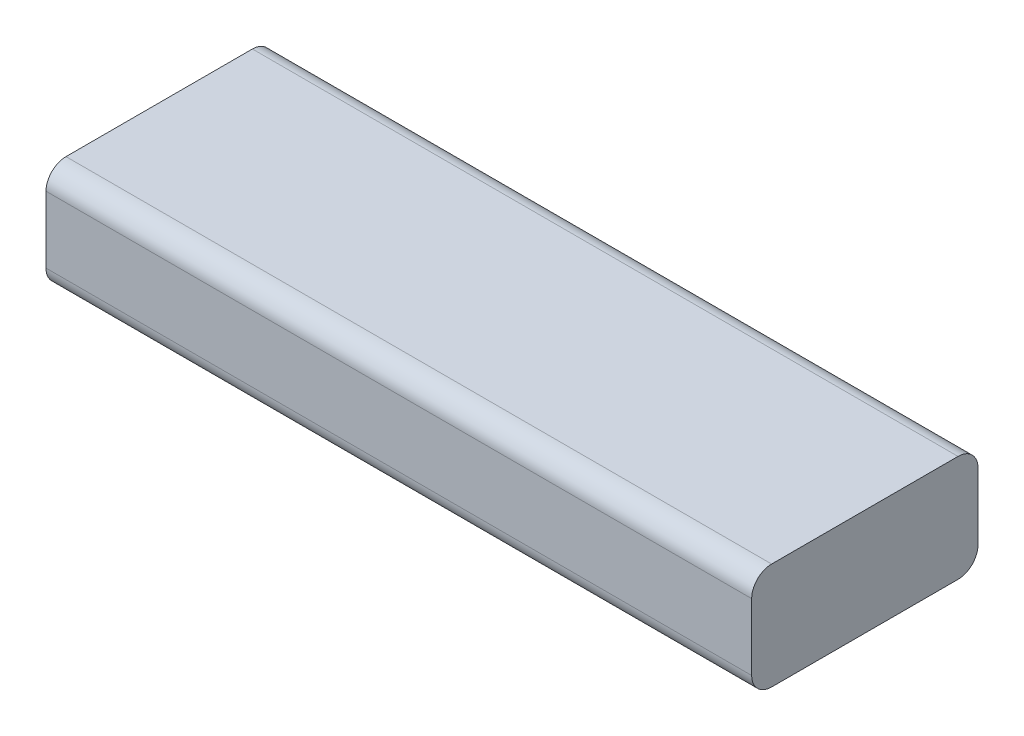
ISO-10303-21;
HEADER;
FILE_DESCRIPTION(('STEP AP214'),'2;1');
FILE_NAME('part.step','',(''),(''),'','','');
FILE_SCHEMA(('AUTOMOTIVE_DESIGN { 1 0 10303 214 1 1 1 1 }'));
ENDSEC;
DATA;
#1=APPLICATION_CONTEXT('core data for automotive mechanical design processes');
#2=APPLICATION_PROTOCOL_DEFINITION('international standard','automotive_design',2000,#1);
#3=PRODUCT_CONTEXT('',#1,'mechanical');
#4=PRODUCT('Part','Part','',(#3));
#5=PRODUCT_RELATED_PRODUCT_CATEGORY('part','',(#4));
#6=PRODUCT_DEFINITION_FORMATION('','',#4);
#7=PRODUCT_DEFINITION_CONTEXT('part definition',#1,'design');
#8=PRODUCT_DEFINITION('design','',#6,#7);
#9=PRODUCT_DEFINITION_SHAPE('','',#8);
#10=(LENGTH_UNIT() NAMED_UNIT(*) SI_UNIT(.MILLI.,.METRE.));
#11=(NAMED_UNIT(*) PLANE_ANGLE_UNIT() SI_UNIT($,.RADIAN.));
#12=(NAMED_UNIT(*) SI_UNIT($,.STERADIAN.) SOLID_ANGLE_UNIT());
#13=UNCERTAINTY_MEASURE_WITH_UNIT(LENGTH_MEASURE(1.E-05),#10,'distance_accuracy_value','');
#14=(GEOMETRIC_REPRESENTATION_CONTEXT(3) GLOBAL_UNCERTAINTY_ASSIGNED_CONTEXT((#13)) GLOBAL_UNIT_ASSIGNED_CONTEXT((#10,
#11,#12)) REPRESENTATION_CONTEXT('',''));
#15=CARTESIAN_POINT('',(0.,0.,0.));
#16=DIRECTION('',(0.,0.,1.));
#17=DIRECTION('',(1.,0.,0.));
#18=AXIS2_PLACEMENT_3D('',#15,#16,#17);
#19=CARTESIAN_POINT('',(0.,16.,0.));
#20=DIRECTION('',(1.,0.,0.));
#21=DIRECTION('',(0.,0.,-1.));
#22=AXIS2_PLACEMENT_3D('',#19,#20,#21);
#23=PLANE('',#22);
#24=DIRECTION('',(0.,-1.,0.));
#25=VECTOR('',#24,1.);
#26=CARTESIAN_POINT('',(0.,16.,-34.));
#27=LINE('',#26,#25);
#28=CARTESIAN_POINT('',(0.,13.,-34.));
#29=VERTEX_POINT('',#28);
#30=CARTESIAN_POINT('',(0.,3.,-34.));
#31=VERTEX_POINT('',#30);
#32=EDGE_CURVE('E108',#29,#31,#27,.T.);
#33=ORIENTED_EDGE('',*,*,#32,.T.);
#34=CARTESIAN_POINT('',(0.,3.,-31.));
#35=DIRECTION('',(1.,0.,0.));
#36=DIRECTION('',(0.,0.,-1.));
#37=AXIS2_PLACEMENT_3D('',#34,#35,#36);
#38=CIRCLE('',#37,3.);
#39=CARTESIAN_POINT('',(0.,0.,-31.));
#40=VERTEX_POINT('',#39);
#41=EDGE_CURVE('E116',#31,#40,#38,.F.);
#42=ORIENTED_EDGE('',*,*,#41,.T.);
#43=DIRECTION('',(0.,0.,1.));
#44=VECTOR('',#43,1.);
#45=CARTESIAN_POINT('',(0.,0.,0.));
#46=LINE('',#45,#44);
#47=CARTESIAN_POINT('',(0.,0.,-3.));
#48=VERTEX_POINT('',#47);
#49=EDGE_CURVE('E194',#40,#48,#46,.T.);
#50=ORIENTED_EDGE('',*,*,#49,.T.);
#51=CARTESIAN_POINT('',(0.,3.,-3.));
#52=DIRECTION('',(1.,0.,0.));
#53=DIRECTION('',(0.,0.,-1.));
#54=AXIS2_PLACEMENT_3D('',#51,#52,#53);
#55=CIRCLE('',#54,3.);
#56=CARTESIAN_POINT('',(0.,3.,0.));
#57=VERTEX_POINT('',#56);
#58=EDGE_CURVE('E117',#48,#57,#55,.F.);
#59=ORIENTED_EDGE('',*,*,#58,.T.);
#60=DIRECTION('',(0.,-1.,0.));
#61=VECTOR('',#60,1.);
#62=CARTESIAN_POINT('',(0.,16.,0.));
#63=LINE('',#62,#61);
#64=CARTESIAN_POINT('',(0.,13.,0.));
#65=VERTEX_POINT('',#64);
#66=EDGE_CURVE('E135',#65,#57,#63,.T.);
#67=ORIENTED_EDGE('',*,*,#66,.F.);
#68=CARTESIAN_POINT('',(0.,13.,-3.));
#69=DIRECTION('',(1.,0.,0.));
#70=DIRECTION('',(0.,0.,-1.));
#71=AXIS2_PLACEMENT_3D('',#68,#69,#70);
#72=CIRCLE('',#71,3.);
#73=CARTESIAN_POINT('',(0.,16.,-3.));
#74=VERTEX_POINT('',#73);
#75=EDGE_CURVE('E139',#65,#74,#72,.F.);
#76=ORIENTED_EDGE('',*,*,#75,.T.);
#77=DIRECTION('',(0.,0.,1.));
#78=VECTOR('',#77,1.);
#79=CARTESIAN_POINT('',(0.,16.,0.));
#80=LINE('',#79,#78);
#81=CARTESIAN_POINT('',(0.,16.,-31.));
#82=VERTEX_POINT('',#81);
#83=EDGE_CURVE('E110',#82,#74,#80,.T.);
#84=ORIENTED_EDGE('',*,*,#83,.F.);
#85=CARTESIAN_POINT('',(0.,13.,-31.));
#86=DIRECTION('',(1.,0.,0.));
#87=DIRECTION('',(0.,0.,-1.));
#88=AXIS2_PLACEMENT_3D('',#85,#86,#87);
#89=CIRCLE('',#88,3.);
#90=EDGE_CURVE('E106',#82,#29,#89,.F.);
#91=ORIENTED_EDGE('',*,*,#90,.T.);
#92=EDGE_LOOP('',(#33,#42,#50,#59,#67,#76,#84,#91));
#93=FACE_BOUND('',#92,.T.);
#94=ADVANCED_FACE('F39',(#93),#23,.F.);
#95=CARTESIAN_POINT('',(0.,16.,0.));
#96=DIRECTION('',(0.,0.,-1.));
#97=DIRECTION('',(-1.,0.,0.));
#98=AXIS2_PLACEMENT_3D('',#95,#96,#97);
#99=PLANE('',#98);
#100=ORIENTED_EDGE('',*,*,#66,.T.);
#101=DIRECTION('',(1.,0.,0.));
#102=VECTOR('',#101,1.);
#103=CARTESIAN_POINT('',(106.,3.,0.));
#104=LINE('',#103,#102);
#105=CARTESIAN_POINT('',(106.,3.,0.));
#106=VERTEX_POINT('',#105);
#107=EDGE_CURVE('E11',#57,#106,#104,.T.);
#108=ORIENTED_EDGE('',*,*,#107,.T.);
#109=DIRECTION('',(0.,-1.,0.));
#110=VECTOR('',#109,1.);
#111=CARTESIAN_POINT('',(106.,16.,0.));
#112=LINE('',#111,#110);
#113=CARTESIAN_POINT('',(106.,13.,0.));
#114=VERTEX_POINT('',#113);
#115=EDGE_CURVE('E142',#114,#106,#112,.T.);
#116=ORIENTED_EDGE('',*,*,#115,.F.);
#117=DIRECTION('',(1.,0.,0.));
#118=VECTOR('',#117,1.);
#119=CARTESIAN_POINT('',(0.,13.,0.));
#120=LINE('',#119,#118);
#121=EDGE_CURVE('E48',#114,#65,#120,.F.);
#122=ORIENTED_EDGE('',*,*,#121,.T.);
#123=EDGE_LOOP('',(#100,#108,#116,#122));
#124=FACE_BOUND('',#123,.T.);
#125=ADVANCED_FACE('F177',(#124),#99,.F.);
#126=CARTESIAN_POINT('',(106.,16.,0.));
#127=DIRECTION('',(-1.,0.,0.));
#128=DIRECTION('',(0.,0.,1.));
#129=AXIS2_PLACEMENT_3D('',#126,#127,#128);
#130=PLANE('',#129);
#131=DIRECTION('',(0.,0.,-1.));
#132=VECTOR('',#131,1.);
#133=CARTESIAN_POINT('',(106.,0.,0.));
#134=LINE('',#133,#132);
#135=CARTESIAN_POINT('',(106.,0.,-3.));
#136=VERTEX_POINT('',#135);
#137=CARTESIAN_POINT('',(106.,0.,-31.));
#138=VERTEX_POINT('',#137);
#139=EDGE_CURVE('E191',#136,#138,#134,.T.);
#140=ORIENTED_EDGE('',*,*,#139,.T.);
#141=CARTESIAN_POINT('',(106.,3.,-31.));
#142=DIRECTION('',(-1.,0.,0.));
#143=DIRECTION('',(0.,0.,1.));
#144=AXIS2_PLACEMENT_3D('',#141,#142,#143);
#145=CIRCLE('',#144,3.);
#146=CARTESIAN_POINT('',(106.,3.,-34.));
#147=VERTEX_POINT('',#146);
#148=EDGE_CURVE('E164',#138,#147,#145,.F.);
#149=ORIENTED_EDGE('',*,*,#148,.T.);
#150=DIRECTION('',(0.,-1.,0.));
#151=VECTOR('',#150,1.);
#152=CARTESIAN_POINT('',(106.,16.,-34.));
#153=LINE('',#152,#151);
#154=CARTESIAN_POINT('',(106.,13.,-34.));
#155=VERTEX_POINT('',#154);
#156=EDGE_CURVE('E128',#155,#147,#153,.T.);
#157=ORIENTED_EDGE('',*,*,#156,.F.);
#158=CARTESIAN_POINT('',(106.,13.,-31.));
#159=DIRECTION('',(-1.,0.,0.));
#160=DIRECTION('',(0.,0.,1.));
#161=AXIS2_PLACEMENT_3D('',#158,#159,#160);
#162=CIRCLE('',#161,3.);
#163=CARTESIAN_POINT('',(106.,16.,-31.));
#164=VERTEX_POINT('',#163);
#165=EDGE_CURVE('E133',#155,#164,#162,.F.);
#166=ORIENTED_EDGE('',*,*,#165,.T.);
#167=DIRECTION('',(0.,0.,-1.));
#168=VECTOR('',#167,1.);
#169=CARTESIAN_POINT('',(106.,16.,0.));
#170=LINE('',#169,#168);
#171=CARTESIAN_POINT('',(106.,16.,-3.));
#172=VERTEX_POINT('',#171);
#173=EDGE_CURVE('E129',#172,#164,#170,.T.);
#174=ORIENTED_EDGE('',*,*,#173,.F.);
#175=CARTESIAN_POINT('',(106.,13.,-3.));
#176=DIRECTION('',(-1.,0.,0.));
#177=DIRECTION('',(0.,0.,1.));
#178=AXIS2_PLACEMENT_3D('',#175,#176,#177);
#179=CIRCLE('',#178,3.);
#180=EDGE_CURVE('E62',#172,#114,#179,.F.);
#181=ORIENTED_EDGE('',*,*,#180,.T.);
#182=ORIENTED_EDGE('',*,*,#115,.T.);
#183=CARTESIAN_POINT('',(106.,3.,-3.));
#184=DIRECTION('',(-1.,0.,0.));
#185=DIRECTION('',(0.,0.,1.));
#186=AXIS2_PLACEMENT_3D('',#183,#184,#185);
#187=CIRCLE('',#186,3.);
#188=EDGE_CURVE('E55',#106,#136,#187,.F.);
#189=ORIENTED_EDGE('',*,*,#188,.T.);
#190=EDGE_LOOP('',(#140,#149,#157,#166,#174,#181,#182,#189));
#191=FACE_BOUND('',#190,.T.);
#192=ADVANCED_FACE('F187',(#191),#130,.F.);
#193=CARTESIAN_POINT('',(0.,16.,-34.));
#194=DIRECTION('',(0.,0.,1.));
#195=DIRECTION('',(1.,0.,0.));
#196=AXIS2_PLACEMENT_3D('',#193,#194,#195);
#197=PLANE('',#196);
#198=ORIENTED_EDGE('',*,*,#156,.T.);
#199=DIRECTION('',(-1.,0.,0.));
#200=VECTOR('',#199,1.);
#201=CARTESIAN_POINT('',(0.,3.,-34.));
#202=LINE('',#201,#200);
#203=EDGE_CURVE('E126',#147,#31,#202,.T.);
#204=ORIENTED_EDGE('',*,*,#203,.T.);
#205=ORIENTED_EDGE('',*,*,#32,.F.);
#206=DIRECTION('',(-1.,0.,0.));
#207=VECTOR('',#206,1.);
#208=CARTESIAN_POINT('',(0.,13.,-34.));
#209=LINE('',#208,#207);
#210=EDGE_CURVE('E123',#29,#155,#209,.F.);
#211=ORIENTED_EDGE('',*,*,#210,.T.);
#212=EDGE_LOOP('',(#198,#204,#205,#211));
#213=FACE_BOUND('',#212,.T.);
#214=ADVANCED_FACE('F122',(#213),#197,.F.);
#215=CARTESIAN_POINT('',(0.,16.,0.));
#216=DIRECTION('',(0.,-1.,0.));
#217=DIRECTION('',(0.,0.,-1.));
#218=AXIS2_PLACEMENT_3D('',#215,#216,#217);
#219=PLANE('',#218);
#220=ORIENTED_EDGE('',*,*,#173,.T.);
#221=DIRECTION('',(-1.,0.,0.));
#222=VECTOR('',#221,1.);
#223=CARTESIAN_POINT('',(0.,16.,-31.));
#224=LINE('',#223,#222);
#225=EDGE_CURVE('E171',#164,#82,#224,.T.);
#226=ORIENTED_EDGE('',*,*,#225,.T.);
#227=ORIENTED_EDGE('',*,*,#83,.T.);
#228=DIRECTION('',(1.,0.,0.));
#229=VECTOR('',#228,1.);
#230=CARTESIAN_POINT('',(0.,16.,-3.));
#231=LINE('',#230,#229);
#232=EDGE_CURVE('E167',#74,#172,#231,.T.);
#233=ORIENTED_EDGE('',*,*,#232,.T.);
#234=EDGE_LOOP('',(#220,#226,#227,#233));
#235=FACE_BOUND('',#234,.T.);
#236=ADVANCED_FACE('F185',(#235),#219,.F.);
#237=CARTESIAN_POINT('',(0.,0.,0.));
#238=DIRECTION('',(0.,-1.,0.));
#239=DIRECTION('',(0.,0.,-1.));
#240=AXIS2_PLACEMENT_3D('',#237,#238,#239);
#241=PLANE('',#240);
#242=ORIENTED_EDGE('',*,*,#49,.F.);
#243=DIRECTION('',(-1.,0.,0.));
#244=VECTOR('',#243,1.);
#245=CARTESIAN_POINT('',(106.,0.,-31.));
#246=LINE('',#245,#244);
#247=EDGE_CURVE('E155',#40,#138,#246,.F.);
#248=ORIENTED_EDGE('',*,*,#247,.T.);
#249=ORIENTED_EDGE('',*,*,#139,.F.);
#250=DIRECTION('',(1.,0.,0.));
#251=VECTOR('',#250,1.);
#252=CARTESIAN_POINT('',(0.,0.,-3.));
#253=LINE('',#252,#251);
#254=EDGE_CURVE('E152',#136,#48,#253,.F.);
#255=ORIENTED_EDGE('',*,*,#254,.T.);
#256=EDGE_LOOP('',(#242,#248,#249,#255));
#257=FACE_BOUND('',#256,.T.);
#258=ADVANCED_FACE('F205',(#257),#241,.T.);
#259=CARTESIAN_POINT('',(0.,3.,-31.));
#260=DIRECTION('',(1.,0.,0.));
#261=DIRECTION('',(0.,0.,-1.));
#262=AXIS2_PLACEMENT_3D('',#259,#260,#261);
#263=CYLINDRICAL_SURFACE('',#262,3.);
#264=ORIENTED_EDGE('',*,*,#148,.F.);
#265=ORIENTED_EDGE('',*,*,#247,.F.);
#266=ORIENTED_EDGE('',*,*,#41,.F.);
#267=ORIENTED_EDGE('',*,*,#203,.F.);
#268=EDGE_LOOP('',(#264,#265,#266,#267));
#269=FACE_BOUND('',#268,.T.);
#270=ADVANCED_FACE('F213',(#269),#263,.T.);
#271=CARTESIAN_POINT('',(0.,13.,-31.));
#272=DIRECTION('',(-1.,0.,0.));
#273=DIRECTION('',(0.,0.,1.));
#274=AXIS2_PLACEMENT_3D('',#271,#272,#273);
#275=CYLINDRICAL_SURFACE('',#274,3.);
#276=ORIENTED_EDGE('',*,*,#165,.F.);
#277=ORIENTED_EDGE('',*,*,#210,.F.);
#278=ORIENTED_EDGE('',*,*,#90,.F.);
#279=ORIENTED_EDGE('',*,*,#225,.F.);
#280=EDGE_LOOP('',(#276,#277,#278,#279));
#281=FACE_BOUND('',#280,.T.);
#282=ADVANCED_FACE('F132',(#281),#275,.T.);
#283=CARTESIAN_POINT('',(0.,3.,-3.));
#284=DIRECTION('',(-1.,0.,0.));
#285=DIRECTION('',(0.,0.,1.));
#286=AXIS2_PLACEMENT_3D('',#283,#284,#285);
#287=CYLINDRICAL_SURFACE('',#286,3.);
#288=ORIENTED_EDGE('',*,*,#58,.F.);
#289=ORIENTED_EDGE('',*,*,#254,.F.);
#290=ORIENTED_EDGE('',*,*,#188,.F.);
#291=ORIENTED_EDGE('',*,*,#107,.F.);
#292=EDGE_LOOP('',(#288,#289,#290,#291));
#293=FACE_BOUND('',#292,.T.);
#294=ADVANCED_FACE('F207',(#293),#287,.T.);
#295=CARTESIAN_POINT('',(0.,13.,-3.));
#296=DIRECTION('',(1.,0.,0.));
#297=DIRECTION('',(0.,0.,-1.));
#298=AXIS2_PLACEMENT_3D('',#295,#296,#297);
#299=CYLINDRICAL_SURFACE('',#298,3.);
#300=ORIENTED_EDGE('',*,*,#75,.F.);
#301=ORIENTED_EDGE('',*,*,#121,.F.);
#302=ORIENTED_EDGE('',*,*,#180,.F.);
#303=ORIENTED_EDGE('',*,*,#232,.F.);
#304=EDGE_LOOP('',(#300,#301,#302,#303));
#305=FACE_BOUND('',#304,.T.);
#306=ADVANCED_FACE('F41',(#305),#299,.T.);
#307=CLOSED_SHELL('',(#94,#125,#192,#214,#236,#258,#270,#282,#294,#306));
#308=MANIFOLD_SOLID_BREP('B2',#307);
#309=ADVANCED_BREP_SHAPE_REPRESENTATION('',(#18,#308),#14);
#310=SHAPE_DEFINITION_REPRESENTATION(#9,#309);
ENDSEC;
END-ISO-10303-21;
